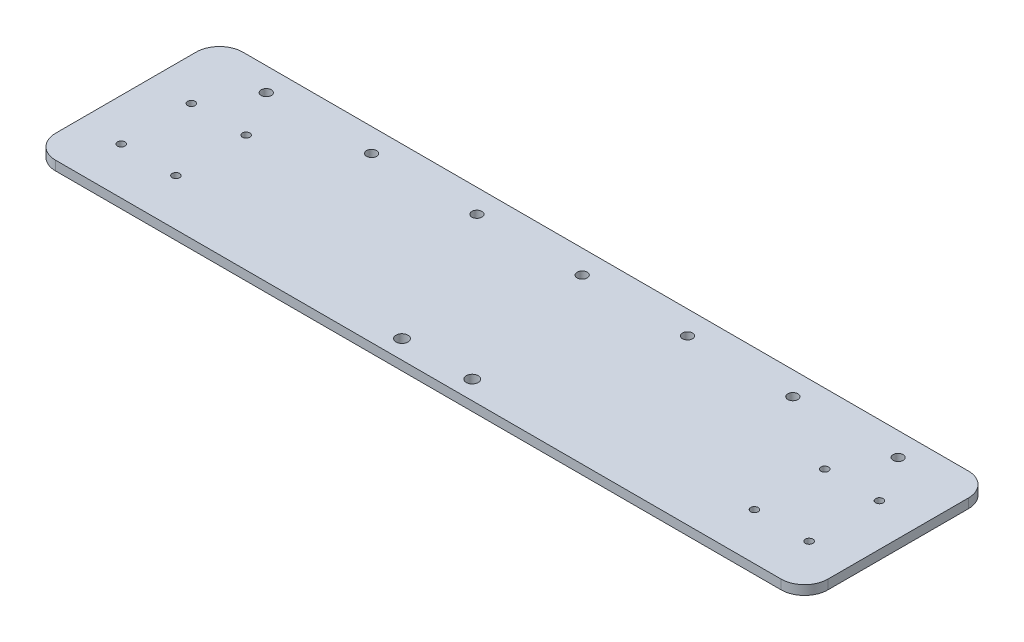
ISO-10303-21;
HEADER;
FILE_DESCRIPTION(('STEP AP214'),'2;1');
FILE_NAME('part.step','',(''),(''),'','','');
FILE_SCHEMA(('AUTOMOTIVE_DESIGN { 1 0 10303 214 1 1 1 1 }'));
ENDSEC;
DATA;
#1=APPLICATION_CONTEXT('core data for automotive mechanical design processes');
#2=APPLICATION_PROTOCOL_DEFINITION('international standard','automotive_design',2000,#1);
#3=PRODUCT_CONTEXT('',#1,'mechanical');
#4=PRODUCT('Part','Part','',(#3));
#5=PRODUCT_RELATED_PRODUCT_CATEGORY('part','',(#4));
#6=PRODUCT_DEFINITION_FORMATION('','',#4);
#7=PRODUCT_DEFINITION_CONTEXT('part definition',#1,'design');
#8=PRODUCT_DEFINITION('design','',#6,#7);
#9=PRODUCT_DEFINITION_SHAPE('','',#8);
#10=(LENGTH_UNIT() NAMED_UNIT(*) SI_UNIT(.MILLI.,.METRE.));
#11=(NAMED_UNIT(*) PLANE_ANGLE_UNIT() SI_UNIT($,.RADIAN.));
#12=(NAMED_UNIT(*) SI_UNIT($,.STERADIAN.) SOLID_ANGLE_UNIT());
#13=UNCERTAINTY_MEASURE_WITH_UNIT(LENGTH_MEASURE(1.E-05),#10,'distance_accuracy_value','');
#14=(GEOMETRIC_REPRESENTATION_CONTEXT(3) GLOBAL_UNCERTAINTY_ASSIGNED_CONTEXT((#13)) GLOBAL_UNIT_ASSIGNED_CONTEXT((#10,
#11,#12)) REPRESENTATION_CONTEXT('',''));
#15=CARTESIAN_POINT('',(0.,0.,0.));
#16=DIRECTION('',(0.,0.,1.));
#17=DIRECTION('',(1.,0.,0.));
#18=AXIS2_PLACEMENT_3D('',#15,#16,#17);
#19=CARTESIAN_POINT('',(0.,4.,0.));
#20=DIRECTION('',(0.,-1.,0.));
#21=DIRECTION('',(0.,0.,-1.));
#22=AXIS2_PLACEMENT_3D('',#19,#20,#21);
#23=PLANE('',#22);
#24=CARTESIAN_POINT('',(-135.,4.,-30.));
#25=DIRECTION('',(0.,1.,0.));
#26=DIRECTION('',(0.,0.,1.));
#27=AXIS2_PLACEMENT_3D('',#24,#25,#26);
#28=CIRCLE('',#27,2.15);
#29=CARTESIAN_POINT('',(-135.,4.,-27.85));
#30=VERTEX_POINT('',#29);
#31=EDGE_CURVE('E583',#30,#30,#28,.T.);
#32=ORIENTED_EDGE('',*,*,#31,.F.);
#33=EDGE_LOOP('',(#32));
#34=FACE_BOUND('',#33,.T.);
#35=CARTESIAN_POINT('',(-90.,4.,-30.));
#36=DIRECTION('',(0.,1.,0.));
#37=DIRECTION('',(0.,0.,1.));
#38=AXIS2_PLACEMENT_3D('',#35,#36,#37);
#39=CIRCLE('',#38,2.15);
#40=CARTESIAN_POINT('',(-90.,4.,-27.85));
#41=VERTEX_POINT('',#40);
#42=EDGE_CURVE('E582',#41,#41,#39,.T.);
#43=ORIENTED_EDGE('',*,*,#42,.F.);
#44=EDGE_LOOP('',(#43));
#45=FACE_BOUND('',#44,.T.);
#46=CARTESIAN_POINT('',(-45.,4.,-30.));
#47=DIRECTION('',(0.,1.,0.));
#48=DIRECTION('',(0.,0.,1.));
#49=AXIS2_PLACEMENT_3D('',#46,#47,#48);
#50=CIRCLE('',#49,2.15);
#51=CARTESIAN_POINT('',(-45.,4.,-27.85));
#52=VERTEX_POINT('',#51);
#53=EDGE_CURVE('E591',#52,#52,#50,.T.);
#54=ORIENTED_EDGE('',*,*,#53,.F.);
#55=EDGE_LOOP('',(#54));
#56=FACE_BOUND('',#55,.T.);
#57=CARTESIAN_POINT('',(135.,4.,-30.));
#58=DIRECTION('',(0.,1.,0.));
#59=DIRECTION('',(0.,0.,1.));
#60=AXIS2_PLACEMENT_3D('',#57,#58,#59);
#61=CIRCLE('',#60,2.15);
#62=CARTESIAN_POINT('',(135.,4.,-27.85));
#63=VERTEX_POINT('',#62);
#64=EDGE_CURVE('E599',#63,#63,#61,.T.);
#65=ORIENTED_EDGE('',*,*,#64,.F.);
#66=EDGE_LOOP('',(#65));
#67=FACE_BOUND('',#66,.T.);
#68=CARTESIAN_POINT('',(90.,4.,-30.));
#69=DIRECTION('',(0.,1.,0.));
#70=DIRECTION('',(0.,0.,1.));
#71=AXIS2_PLACEMENT_3D('',#68,#69,#70);
#72=CIRCLE('',#71,2.15);
#73=CARTESIAN_POINT('',(90.,4.,-27.85));
#74=VERTEX_POINT('',#73);
#75=EDGE_CURVE('E607',#74,#74,#72,.T.);
#76=ORIENTED_EDGE('',*,*,#75,.F.);
#77=EDGE_LOOP('',(#76));
#78=FACE_BOUND('',#77,.T.);
#79=CARTESIAN_POINT('',(45.,4.,-30.));
#80=DIRECTION('',(0.,1.,0.));
#81=DIRECTION('',(0.,0.,1.));
#82=AXIS2_PLACEMENT_3D('',#79,#80,#81);
#83=CIRCLE('',#82,2.15);
#84=CARTESIAN_POINT('',(45.,4.,-27.85));
#85=VERTEX_POINT('',#84);
#86=EDGE_CURVE('E574',#85,#85,#83,.T.);
#87=ORIENTED_EDGE('',*,*,#86,.F.);
#88=EDGE_LOOP('',(#87));
#89=FACE_BOUND('',#88,.T.);
#90=CARTESIAN_POINT('',(0.,4.,-30.));
#91=DIRECTION('',(0.,1.,0.));
#92=DIRECTION('',(0.,0.,1.));
#93=AXIS2_PLACEMENT_3D('',#90,#91,#92);
#94=CIRCLE('',#93,2.15);
#95=CARTESIAN_POINT('',(0.,4.,-27.85));
#96=VERTEX_POINT('',#95);
#97=EDGE_CURVE('E544',#96,#96,#94,.T.);
#98=ORIENTED_EDGE('',*,*,#97,.F.);
#99=EDGE_LOOP('',(#98));
#100=FACE_BOUND('',#99,.T.);
#101=CARTESIAN_POINT('',(123.6,4.,-10.));
#102=DIRECTION('',(0.,-1.,0.));
#103=DIRECTION('',(0.,0.,1.));
#104=AXIS2_PLACEMENT_3D('',#101,#102,#103);
#105=CIRCLE('',#104,1.60000000000002);
#106=CARTESIAN_POINT('',(123.6,4.,-8.40000000000002));
#107=VERTEX_POINT('',#106);
#108=EDGE_CURVE('E543',#107,#107,#105,.T.);
#109=ORIENTED_EDGE('',*,*,#108,.T.);
#110=EDGE_LOOP('',(#109));
#111=FACE_BOUND('',#110,.T.);
#112=CARTESIAN_POINT('',(123.6,4.,20.));
#113=DIRECTION('',(0.,-1.,0.));
#114=DIRECTION('',(0.,0.,1.));
#115=AXIS2_PLACEMENT_3D('',#112,#113,#114);
#116=CIRCLE('',#115,1.60000000000002);
#117=CARTESIAN_POINT('',(123.6,4.,21.6));
#118=VERTEX_POINT('',#117);
#119=EDGE_CURVE('E552',#118,#118,#116,.T.);
#120=ORIENTED_EDGE('',*,*,#119,.T.);
#121=EDGE_LOOP('',(#120));
#122=FACE_BOUND('',#121,.T.);
#123=CARTESIAN_POINT('',(147.,4.,20.));
#124=DIRECTION('',(0.,-1.,0.));
#125=DIRECTION('',(0.,0.,1.));
#126=AXIS2_PLACEMENT_3D('',#123,#124,#125);
#127=CIRCLE('',#126,1.59999999999999);
#128=CARTESIAN_POINT('',(147.,4.,21.5999999999999));
#129=VERTEX_POINT('',#128);
#130=EDGE_CURVE('E537',#129,#129,#127,.T.);
#131=ORIENTED_EDGE('',*,*,#130,.T.);
#132=EDGE_LOOP('',(#131));
#133=FACE_BOUND('',#132,.T.);
#134=CARTESIAN_POINT('',(147.,4.,-10.));
#135=DIRECTION('',(0.,-1.,0.));
#136=DIRECTION('',(0.,0.,1.));
#137=AXIS2_PLACEMENT_3D('',#134,#135,#136);
#138=CIRCLE('',#137,1.59999999999999);
#139=CARTESIAN_POINT('',(147.,4.,-8.40000000000005));
#140=VERTEX_POINT('',#139);
#141=EDGE_CURVE('E528',#140,#140,#138,.T.);
#142=ORIENTED_EDGE('',*,*,#141,.T.);
#143=EDGE_LOOP('',(#142));
#144=FACE_BOUND('',#143,.T.);
#145=CARTESIAN_POINT('',(-123.6,4.,-10.));
#146=DIRECTION('',(0.,1.,0.));
#147=DIRECTION('',(0.,0.,1.));
#148=AXIS2_PLACEMENT_3D('',#145,#146,#147);
#149=CIRCLE('',#148,1.60000000000002);
#150=CARTESIAN_POINT('',(-123.6,4.,-8.40000000000002));
#151=VERTEX_POINT('',#150);
#152=EDGE_CURVE('E521',#151,#151,#149,.T.);
#153=ORIENTED_EDGE('',*,*,#152,.F.);
#154=EDGE_LOOP('',(#153));
#155=FACE_BOUND('',#154,.T.);
#156=CARTESIAN_POINT('',(-123.6,4.,20.));
#157=DIRECTION('',(0.,1.,0.));
#158=DIRECTION('',(0.,0.,1.));
#159=AXIS2_PLACEMENT_3D('',#156,#157,#158);
#160=CIRCLE('',#159,1.60000000000002);
#161=CARTESIAN_POINT('',(-123.6,4.,21.6));
#162=VERTEX_POINT('',#161);
#163=EDGE_CURVE('E508',#162,#162,#160,.T.);
#164=ORIENTED_EDGE('',*,*,#163,.F.);
#165=EDGE_LOOP('',(#164));
#166=FACE_BOUND('',#165,.T.);
#167=CARTESIAN_POINT('',(-147.,4.,20.));
#168=DIRECTION('',(0.,1.,0.));
#169=DIRECTION('',(0.,0.,1.));
#170=AXIS2_PLACEMENT_3D('',#167,#168,#169);
#171=CIRCLE('',#170,1.59999999999999);
#172=CARTESIAN_POINT('',(-147.,4.,21.5999999999999));
#173=VERTEX_POINT('',#172);
#174=EDGE_CURVE('E499',#173,#173,#171,.T.);
#175=ORIENTED_EDGE('',*,*,#174,.F.);
#176=EDGE_LOOP('',(#175));
#177=FACE_BOUND('',#176,.T.);
#178=CARTESIAN_POINT('',(-147.,4.,-10.));
#179=DIRECTION('',(0.,1.,0.));
#180=DIRECTION('',(0.,0.,1.));
#181=AXIS2_PLACEMENT_3D('',#178,#179,#180);
#182=CIRCLE('',#181,1.59999999999999);
#183=CARTESIAN_POINT('',(-147.,4.,-8.40000000000005));
#184=VERTEX_POINT('',#183);
#185=EDGE_CURVE('E225',#184,#184,#182,.T.);
#186=ORIENTED_EDGE('',*,*,#185,.F.);
#187=EDGE_LOOP('',(#186));
#188=FACE_BOUND('',#187,.T.);
#189=DIRECTION('',(1.,0.,0.));
#190=VECTOR('',#189,1.);
#191=CARTESIAN_POINT('',(-165.,4.,40.));
#192=LINE('',#191,#190);
#193=CARTESIAN_POINT('',(-155.,4.,40.));
#194=VERTEX_POINT('',#193);
#195=CARTESIAN_POINT('',(155.,4.,40.));
#196=VERTEX_POINT('',#195);
#197=EDGE_CURVE('E149',#194,#196,#192,.T.);
#198=ORIENTED_EDGE('',*,*,#197,.T.);
#199=CARTESIAN_POINT('',(155.,4.,30.));
#200=DIRECTION('',(0.,-1.,0.));
#201=DIRECTION('',(0.,0.,-1.));
#202=AXIS2_PLACEMENT_3D('',#199,#200,#201);
#203=CIRCLE('',#202,10.);
#204=CARTESIAN_POINT('',(165.,4.,30.));
#205=VERTEX_POINT('',#204);
#206=EDGE_CURVE('E173',#196,#205,#203,.F.);
#207=ORIENTED_EDGE('',*,*,#206,.T.);
#208=DIRECTION('',(0.,0.,-1.));
#209=VECTOR('',#208,1.);
#210=CARTESIAN_POINT('',(165.,4.,-40.));
#211=LINE('',#210,#209);
#212=CARTESIAN_POINT('',(165.,4.,-30.));
#213=VERTEX_POINT('',#212);
#214=EDGE_CURVE('E126',#205,#213,#211,.T.);
#215=ORIENTED_EDGE('',*,*,#214,.T.);
#216=CARTESIAN_POINT('',(155.,4.,-30.));
#217=DIRECTION('',(0.,-1.,0.));
#218=DIRECTION('',(0.,0.,-1.));
#219=AXIS2_PLACEMENT_3D('',#216,#217,#218);
#220=CIRCLE('',#219,10.);
#221=CARTESIAN_POINT('',(155.,4.,-40.));
#222=VERTEX_POINT('',#221);
#223=EDGE_CURVE('E170',#213,#222,#220,.F.);
#224=ORIENTED_EDGE('',*,*,#223,.T.);
#225=DIRECTION('',(-1.,0.,0.));
#226=VECTOR('',#225,1.);
#227=CARTESIAN_POINT('',(165.,4.,-40.));
#228=LINE('',#227,#226);
#229=CARTESIAN_POINT('',(-155.,4.,-40.));
#230=VERTEX_POINT('',#229);
#231=EDGE_CURVE('E199',#222,#230,#228,.T.);
#232=ORIENTED_EDGE('',*,*,#231,.T.);
#233=CARTESIAN_POINT('',(-155.,4.,-30.));
#234=DIRECTION('',(0.,-1.,0.));
#235=DIRECTION('',(0.,0.,-1.));
#236=AXIS2_PLACEMENT_3D('',#233,#234,#235);
#237=CIRCLE('',#236,10.);
#238=CARTESIAN_POINT('',(-165.,4.,-30.));
#239=VERTEX_POINT('',#238);
#240=EDGE_CURVE('E60',#230,#239,#237,.F.);
#241=ORIENTED_EDGE('',*,*,#240,.T.);
#242=DIRECTION('',(0.,0.,1.));
#243=VECTOR('',#242,1.);
#244=CARTESIAN_POINT('',(-165.,4.,-40.));
#245=LINE('',#244,#243);
#246=CARTESIAN_POINT('',(-165.,4.,30.));
#247=VERTEX_POINT('',#246);
#248=EDGE_CURVE('E151',#239,#247,#245,.T.);
#249=ORIENTED_EDGE('',*,*,#248,.T.);
#250=CARTESIAN_POINT('',(-155.,4.,30.));
#251=DIRECTION('',(0.,-1.,0.));
#252=DIRECTION('',(0.,0.,-1.));
#253=AXIS2_PLACEMENT_3D('',#250,#251,#252);
#254=CIRCLE('',#253,10.);
#255=EDGE_CURVE('E167',#247,#194,#254,.F.);
#256=ORIENTED_EDGE('',*,*,#255,.T.);
#257=EDGE_LOOP('',(#198,#207,#215,#224,#232,#241,#249,#256));
#258=FACE_BOUND('',#257,.T.);
#259=CARTESIAN_POINT('',(-15.,4.,32.));
#260=DIRECTION('',(0.,1.,0.));
#261=DIRECTION('',(0.,0.,1.));
#262=AXIS2_PLACEMENT_3D('',#259,#260,#261);
#263=CIRCLE('',#262,2.55);
#264=CARTESIAN_POINT('',(-15.,4.,34.55));
#265=VERTEX_POINT('',#264);
#266=EDGE_CURVE('E143',#265,#265,#263,.T.);
#267=ORIENTED_EDGE('',*,*,#266,.F.);
#268=EDGE_LOOP('',(#267));
#269=FACE_BOUND('',#268,.T.);
#270=CARTESIAN_POINT('',(15.,4.,32.));
#271=DIRECTION('',(0.,1.,0.));
#272=DIRECTION('',(0.,0.,1.));
#273=AXIS2_PLACEMENT_3D('',#270,#271,#272);
#274=CIRCLE('',#273,2.54999999999999);
#275=CARTESIAN_POINT('',(15.,4.,34.55));
#276=VERTEX_POINT('',#275);
#277=EDGE_CURVE('E216',#276,#276,#274,.T.);
#278=ORIENTED_EDGE('',*,*,#277,.F.);
#279=EDGE_LOOP('',(#278));
#280=FACE_BOUND('',#279,.T.);
#281=ADVANCED_FACE('F39',(#34,#45,#56,#67,#78,#89,#100,#111,#122,#133,#144,#155,#166,#177,#188,
#258,#269,#280),#23,.F.);
#282=CARTESIAN_POINT('',(0.,0.,0.));
#283=DIRECTION('',(0.,-1.,0.));
#284=DIRECTION('',(0.,0.,-1.));
#285=AXIS2_PLACEMENT_3D('',#282,#283,#284);
#286=PLANE('',#285);
#287=CARTESIAN_POINT('',(-135.,0.,-30.));
#288=DIRECTION('',(0.,1.,0.));
#289=DIRECTION('',(0.,0.,1.));
#290=AXIS2_PLACEMENT_3D('',#287,#288,#289);
#291=CIRCLE('',#290,2.15);
#292=CARTESIAN_POINT('',(-135.,0.,-27.85));
#293=VERTEX_POINT('',#292);
#294=EDGE_CURVE('E579',#293,#293,#291,.T.);
#295=ORIENTED_EDGE('',*,*,#294,.T.);
#296=EDGE_LOOP('',(#295));
#297=FACE_BOUND('',#296,.T.);
#298=CARTESIAN_POINT('',(-90.,0.,-30.));
#299=DIRECTION('',(0.,1.,0.));
#300=DIRECTION('',(0.,0.,1.));
#301=AXIS2_PLACEMENT_3D('',#298,#299,#300);
#302=CIRCLE('',#301,2.15);
#303=CARTESIAN_POINT('',(-90.,0.,-27.85));
#304=VERTEX_POINT('',#303);
#305=EDGE_CURVE('E587',#304,#304,#302,.T.);
#306=ORIENTED_EDGE('',*,*,#305,.T.);
#307=EDGE_LOOP('',(#306));
#308=FACE_BOUND('',#307,.T.);
#309=CARTESIAN_POINT('',(-45.,0.,-30.));
#310=DIRECTION('',(0.,1.,0.));
#311=DIRECTION('',(0.,0.,1.));
#312=AXIS2_PLACEMENT_3D('',#309,#310,#311);
#313=CIRCLE('',#312,2.15);
#314=CARTESIAN_POINT('',(-45.,0.,-27.85));
#315=VERTEX_POINT('',#314);
#316=EDGE_CURVE('E595',#315,#315,#313,.T.);
#317=ORIENTED_EDGE('',*,*,#316,.T.);
#318=EDGE_LOOP('',(#317));
#319=FACE_BOUND('',#318,.T.);
#320=CARTESIAN_POINT('',(135.,0.,-30.));
#321=DIRECTION('',(0.,1.,0.));
#322=DIRECTION('',(0.,0.,1.));
#323=AXIS2_PLACEMENT_3D('',#320,#321,#322);
#324=CIRCLE('',#323,2.15);
#325=CARTESIAN_POINT('',(135.,0.,-27.85));
#326=VERTEX_POINT('',#325);
#327=EDGE_CURVE('E603',#326,#326,#324,.T.);
#328=ORIENTED_EDGE('',*,*,#327,.T.);
#329=EDGE_LOOP('',(#328));
#330=FACE_BOUND('',#329,.T.);
#331=CARTESIAN_POINT('',(90.,0.,-30.));
#332=DIRECTION('',(0.,1.,0.));
#333=DIRECTION('',(0.,0.,1.));
#334=AXIS2_PLACEMENT_3D('',#331,#332,#333);
#335=CIRCLE('',#334,2.15);
#336=CARTESIAN_POINT('',(90.,0.,-27.85));
#337=VERTEX_POINT('',#336);
#338=EDGE_CURVE('E578',#337,#337,#335,.T.);
#339=ORIENTED_EDGE('',*,*,#338,.T.);
#340=EDGE_LOOP('',(#339));
#341=FACE_BOUND('',#340,.T.);
#342=CARTESIAN_POINT('',(45.,0.,-30.));
#343=DIRECTION('',(0.,1.,0.));
#344=DIRECTION('',(0.,0.,1.));
#345=AXIS2_PLACEMENT_3D('',#342,#343,#344);
#346=CIRCLE('',#345,2.15);
#347=CARTESIAN_POINT('',(45.,0.,-27.85));
#348=VERTEX_POINT('',#347);
#349=EDGE_CURVE('E567',#348,#348,#346,.T.);
#350=ORIENTED_EDGE('',*,*,#349,.T.);
#351=EDGE_LOOP('',(#350));
#352=FACE_BOUND('',#351,.T.);
#353=CARTESIAN_POINT('',(0.,0.,-30.));
#354=DIRECTION('',(0.,1.,0.));
#355=DIRECTION('',(0.,0.,1.));
#356=AXIS2_PLACEMENT_3D('',#353,#354,#355);
#357=CIRCLE('',#356,2.15);
#358=CARTESIAN_POINT('',(0.,0.,-27.85));
#359=VERTEX_POINT('',#358);
#360=EDGE_CURVE('E563',#359,#359,#357,.T.);
#361=ORIENTED_EDGE('',*,*,#360,.T.);
#362=EDGE_LOOP('',(#361));
#363=FACE_BOUND('',#362,.T.);
#364=CARTESIAN_POINT('',(123.6,0.,-10.));
#365=DIRECTION('',(0.,-1.,0.));
#366=DIRECTION('',(0.,0.,1.));
#367=AXIS2_PLACEMENT_3D('',#364,#365,#366);
#368=CIRCLE('',#367,1.60000000000002);
#369=CARTESIAN_POINT('',(123.6,0.,-8.40000000000002));
#370=VERTEX_POINT('',#369);
#371=EDGE_CURVE('E539',#370,#370,#368,.T.);
#372=ORIENTED_EDGE('',*,*,#371,.F.);
#373=EDGE_LOOP('',(#372));
#374=FACE_BOUND('',#373,.T.);
#375=CARTESIAN_POINT('',(123.6,0.,20.));
#376=DIRECTION('',(0.,-1.,0.));
#377=DIRECTION('',(0.,0.,1.));
#378=AXIS2_PLACEMENT_3D('',#375,#376,#377);
#379=CIRCLE('',#378,1.60000000000002);
#380=CARTESIAN_POINT('',(123.6,0.,21.6));
#381=VERTEX_POINT('',#380);
#382=EDGE_CURVE('E548',#381,#381,#379,.T.);
#383=ORIENTED_EDGE('',*,*,#382,.F.);
#384=EDGE_LOOP('',(#383));
#385=FACE_BOUND('',#384,.T.);
#386=CARTESIAN_POINT('',(147.,0.,20.));
#387=DIRECTION('',(0.,-1.,0.));
#388=DIRECTION('',(0.,0.,1.));
#389=AXIS2_PLACEMENT_3D('',#386,#387,#388);
#390=CIRCLE('',#389,1.59999999999999);
#391=CARTESIAN_POINT('',(147.,0.,21.5999999999999));
#392=VERTEX_POINT('',#391);
#393=EDGE_CURVE('E556',#392,#392,#390,.T.);
#394=ORIENTED_EDGE('',*,*,#393,.F.);
#395=EDGE_LOOP('',(#394));
#396=FACE_BOUND('',#395,.T.);
#397=CARTESIAN_POINT('',(147.,0.,-10.));
#398=DIRECTION('',(0.,-1.,0.));
#399=DIRECTION('',(0.,0.,1.));
#400=AXIS2_PLACEMENT_3D('',#397,#398,#399);
#401=CIRCLE('',#400,1.59999999999999);
#402=CARTESIAN_POINT('',(147.,0.,-8.40000000000005));
#403=VERTEX_POINT('',#402);
#404=EDGE_CURVE('E511',#403,#403,#401,.T.);
#405=ORIENTED_EDGE('',*,*,#404,.F.);
#406=EDGE_LOOP('',(#405));
#407=FACE_BOUND('',#406,.T.);
#408=CARTESIAN_POINT('',(-123.6,0.,-10.));
#409=DIRECTION('',(0.,1.,0.));
#410=DIRECTION('',(0.,0.,1.));
#411=AXIS2_PLACEMENT_3D('',#408,#409,#410);
#412=CIRCLE('',#411,1.60000000000002);
#413=CARTESIAN_POINT('',(-123.6,0.,-8.40000000000002));
#414=VERTEX_POINT('',#413);
#415=EDGE_CURVE('E525',#414,#414,#412,.T.);
#416=ORIENTED_EDGE('',*,*,#415,.T.);
#417=EDGE_LOOP('',(#416));
#418=FACE_BOUND('',#417,.T.);
#419=CARTESIAN_POINT('',(-123.6,0.,20.));
#420=DIRECTION('',(0.,1.,0.));
#421=DIRECTION('',(0.,0.,1.));
#422=AXIS2_PLACEMENT_3D('',#419,#420,#421);
#423=CIRCLE('',#422,1.60000000000002);
#424=CARTESIAN_POINT('',(-123.6,0.,21.6));
#425=VERTEX_POINT('',#424);
#426=EDGE_CURVE('E517',#425,#425,#423,.T.);
#427=ORIENTED_EDGE('',*,*,#426,.T.);
#428=EDGE_LOOP('',(#427));
#429=FACE_BOUND('',#428,.T.);
#430=CARTESIAN_POINT('',(-147.,0.,20.));
#431=DIRECTION('',(0.,1.,0.));
#432=DIRECTION('',(0.,0.,1.));
#433=AXIS2_PLACEMENT_3D('',#430,#431,#432);
#434=CIRCLE('',#433,1.59999999999999);
#435=CARTESIAN_POINT('',(-147.,0.,21.5999999999999));
#436=VERTEX_POINT('',#435);
#437=EDGE_CURVE('E503',#436,#436,#434,.T.);
#438=ORIENTED_EDGE('',*,*,#437,.T.);
#439=EDGE_LOOP('',(#438));
#440=FACE_BOUND('',#439,.T.);
#441=CARTESIAN_POINT('',(-147.,0.,-10.));
#442=DIRECTION('',(0.,1.,0.));
#443=DIRECTION('',(0.,0.,1.));
#444=AXIS2_PLACEMENT_3D('',#441,#442,#443);
#445=CIRCLE('',#444,1.59999999999999);
#446=CARTESIAN_POINT('',(-147.,0.,-8.40000000000005));
#447=VERTEX_POINT('',#446);
#448=EDGE_CURVE('E228',#447,#447,#445,.T.);
#449=ORIENTED_EDGE('',*,*,#448,.T.);
#450=EDGE_LOOP('',(#449));
#451=FACE_BOUND('',#450,.T.);
#452=CARTESIAN_POINT('',(-15.,0.,32.));
#453=DIRECTION('',(0.,1.,0.));
#454=DIRECTION('',(0.,0.,1.));
#455=AXIS2_PLACEMENT_3D('',#452,#453,#454);
#456=CIRCLE('',#455,2.55);
#457=CARTESIAN_POINT('',(-15.,0.,34.55));
#458=VERTEX_POINT('',#457);
#459=EDGE_CURVE('E202',#458,#458,#456,.T.);
#460=ORIENTED_EDGE('',*,*,#459,.T.);
#461=EDGE_LOOP('',(#460));
#462=FACE_BOUND('',#461,.T.);
#463=DIRECTION('',(0.,0.,-1.));
#464=VECTOR('',#463,1.);
#465=CARTESIAN_POINT('',(165.,0.,-40.));
#466=LINE('',#465,#464);
#467=CARTESIAN_POINT('',(165.,0.,30.));
#468=VERTEX_POINT('',#467);
#469=CARTESIAN_POINT('',(165.,0.,-30.));
#470=VERTEX_POINT('',#469);
#471=EDGE_CURVE('E123',#468,#470,#466,.T.);
#472=ORIENTED_EDGE('',*,*,#471,.F.);
#473=CARTESIAN_POINT('',(155.,0.,30.));
#474=DIRECTION('',(0.,-1.,0.));
#475=DIRECTION('',(0.,0.,-1.));
#476=AXIS2_PLACEMENT_3D('',#473,#474,#475);
#477=CIRCLE('',#476,10.);
#478=CARTESIAN_POINT('',(155.,0.,40.));
#479=VERTEX_POINT('',#478);
#480=EDGE_CURVE('E105',#468,#479,#477,.T.);
#481=ORIENTED_EDGE('',*,*,#480,.T.);
#482=DIRECTION('',(1.,0.,0.));
#483=VECTOR('',#482,1.);
#484=CARTESIAN_POINT('',(-165.,0.,40.));
#485=LINE('',#484,#483);
#486=CARTESIAN_POINT('',(-155.,0.,40.));
#487=VERTEX_POINT('',#486);
#488=EDGE_CURVE('E136',#487,#479,#485,.T.);
#489=ORIENTED_EDGE('',*,*,#488,.F.);
#490=CARTESIAN_POINT('',(-155.,0.,30.));
#491=DIRECTION('',(0.,-1.,0.));
#492=DIRECTION('',(0.,0.,-1.));
#493=AXIS2_PLACEMENT_3D('',#490,#491,#492);
#494=CIRCLE('',#493,10.);
#495=CARTESIAN_POINT('',(-165.,0.,30.));
#496=VERTEX_POINT('',#495);
#497=EDGE_CURVE('E155',#487,#496,#494,.T.);
#498=ORIENTED_EDGE('',*,*,#497,.T.);
#499=DIRECTION('',(0.,0.,1.));
#500=VECTOR('',#499,1.);
#501=CARTESIAN_POINT('',(-165.,0.,-40.));
#502=LINE('',#501,#500);
#503=CARTESIAN_POINT('',(-165.,0.,-30.));
#504=VERTEX_POINT('',#503);
#505=EDGE_CURVE('E141',#504,#496,#502,.T.);
#506=ORIENTED_EDGE('',*,*,#505,.F.);
#507=CARTESIAN_POINT('',(-155.,0.,-30.));
#508=DIRECTION('',(0.,-1.,0.));
#509=DIRECTION('',(0.,0.,-1.));
#510=AXIS2_PLACEMENT_3D('',#507,#508,#509);
#511=CIRCLE('',#510,10.);
#512=CARTESIAN_POINT('',(-155.,0.,-40.));
#513=VERTEX_POINT('',#512);
#514=EDGE_CURVE('E128',#504,#513,#511,.T.);
#515=ORIENTED_EDGE('',*,*,#514,.T.);
#516=DIRECTION('',(-1.,0.,0.));
#517=VECTOR('',#516,1.);
#518=CARTESIAN_POINT('',(165.,0.,-40.));
#519=LINE('',#518,#517);
#520=CARTESIAN_POINT('',(155.,0.,-40.));
#521=VERTEX_POINT('',#520);
#522=EDGE_CURVE('E135',#521,#513,#519,.T.);
#523=ORIENTED_EDGE('',*,*,#522,.F.);
#524=CARTESIAN_POINT('',(155.,0.,-30.));
#525=DIRECTION('',(0.,-1.,0.));
#526=DIRECTION('',(0.,0.,-1.));
#527=AXIS2_PLACEMENT_3D('',#524,#525,#526);
#528=CIRCLE('',#527,10.);
#529=EDGE_CURVE('E117',#521,#470,#528,.T.);
#530=ORIENTED_EDGE('',*,*,#529,.T.);
#531=EDGE_LOOP('',(#472,#481,#489,#498,#506,#515,#523,#530));
#532=FACE_BOUND('',#531,.T.);
#533=CARTESIAN_POINT('',(15.,0.,32.));
#534=DIRECTION('',(0.,1.,0.));
#535=DIRECTION('',(0.,0.,1.));
#536=AXIS2_PLACEMENT_3D('',#533,#534,#535);
#537=CIRCLE('',#536,2.54999999999999);
#538=CARTESIAN_POINT('',(15.,0.,34.55));
#539=VERTEX_POINT('',#538);
#540=EDGE_CURVE('E219',#539,#539,#537,.T.);
#541=ORIENTED_EDGE('',*,*,#540,.T.);
#542=EDGE_LOOP('',(#541));
#543=FACE_BOUND('',#542,.T.);
#544=ADVANCED_FACE('F131',(#297,#308,#319,#330,#341,#352,#363,#374,#385,#396,#407,#418,#429,
#440,#451,#462,#532,#543),#286,.T.);
#545=CARTESIAN_POINT('',(-165.,4.,40.));
#546=DIRECTION('',(0.,0.,-1.));
#547=DIRECTION('',(-1.,0.,0.));
#548=AXIS2_PLACEMENT_3D('',#545,#546,#547);
#549=PLANE('',#548);
#550=ORIENTED_EDGE('',*,*,#488,.T.);
#551=DIRECTION('',(0.,-1.,0.));
#552=VECTOR('',#551,1.);
#553=CARTESIAN_POINT('',(155.,4.,40.));
#554=LINE('',#553,#552);
#555=EDGE_CURVE('E110',#479,#196,#554,.F.);
#556=ORIENTED_EDGE('',*,*,#555,.T.);
#557=ORIENTED_EDGE('',*,*,#197,.F.);
#558=DIRECTION('',(0.,-1.,0.));
#559=VECTOR('',#558,1.);
#560=CARTESIAN_POINT('',(-155.,4.,40.));
#561=LINE('',#560,#559);
#562=EDGE_CURVE('E116',#194,#487,#561,.T.);
#563=ORIENTED_EDGE('',*,*,#562,.T.);
#564=EDGE_LOOP('',(#550,#556,#557,#563));
#565=FACE_BOUND('',#564,.T.);
#566=ADVANCED_FACE('F194',(#565),#549,.F.);
#567=CARTESIAN_POINT('',(165.,4.,-40.));
#568=DIRECTION('',(-1.,0.,0.));
#569=DIRECTION('',(0.,0.,1.));
#570=AXIS2_PLACEMENT_3D('',#567,#568,#569);
#571=PLANE('',#570);
#572=ORIENTED_EDGE('',*,*,#214,.F.);
#573=DIRECTION('',(0.,-1.,0.));
#574=VECTOR('',#573,1.);
#575=CARTESIAN_POINT('',(165.,4.,30.));
#576=LINE('',#575,#574);
#577=EDGE_CURVE('E109',#205,#468,#576,.T.);
#578=ORIENTED_EDGE('',*,*,#577,.T.);
#579=ORIENTED_EDGE('',*,*,#471,.T.);
#580=DIRECTION('',(0.,-1.,0.));
#581=VECTOR('',#580,1.);
#582=CARTESIAN_POINT('',(165.,4.,-30.));
#583=LINE('',#582,#581);
#584=EDGE_CURVE('E129',#470,#213,#583,.F.);
#585=ORIENTED_EDGE('',*,*,#584,.T.);
#586=EDGE_LOOP('',(#572,#578,#579,#585));
#587=FACE_BOUND('',#586,.T.);
#588=ADVANCED_FACE('F122',(#587),#571,.F.);
#589=CARTESIAN_POINT('',(165.,4.,-40.));
#590=DIRECTION('',(0.,0.,1.));
#591=DIRECTION('',(1.,0.,0.));
#592=AXIS2_PLACEMENT_3D('',#589,#590,#591);
#593=PLANE('',#592);
#594=ORIENTED_EDGE('',*,*,#231,.F.);
#595=DIRECTION('',(0.,-1.,0.));
#596=VECTOR('',#595,1.);
#597=CARTESIAN_POINT('',(155.,4.,-40.));
#598=LINE('',#597,#596);
#599=EDGE_CURVE('E179',#222,#521,#598,.T.);
#600=ORIENTED_EDGE('',*,*,#599,.T.);
#601=ORIENTED_EDGE('',*,*,#522,.T.);
#602=DIRECTION('',(0.,-1.,0.));
#603=VECTOR('',#602,1.);
#604=CARTESIAN_POINT('',(-155.,4.,-40.));
#605=LINE('',#604,#603);
#606=EDGE_CURVE('E176',#513,#230,#605,.F.);
#607=ORIENTED_EDGE('',*,*,#606,.T.);
#608=EDGE_LOOP('',(#594,#600,#601,#607));
#609=FACE_BOUND('',#608,.T.);
#610=ADVANCED_FACE('F251',(#609),#593,.F.);
#611=CARTESIAN_POINT('',(-165.,4.,-40.));
#612=DIRECTION('',(1.,0.,0.));
#613=DIRECTION('',(0.,0.,-1.));
#614=AXIS2_PLACEMENT_3D('',#611,#612,#613);
#615=PLANE('',#614);
#616=ORIENTED_EDGE('',*,*,#505,.T.);
#617=DIRECTION('',(0.,-1.,0.));
#618=VECTOR('',#617,1.);
#619=CARTESIAN_POINT('',(-165.,4.,30.));
#620=LINE('',#619,#618);
#621=EDGE_CURVE('E11',#496,#247,#620,.F.);
#622=ORIENTED_EDGE('',*,*,#621,.T.);
#623=ORIENTED_EDGE('',*,*,#248,.F.);
#624=DIRECTION('',(0.,-1.,0.));
#625=VECTOR('',#624,1.);
#626=CARTESIAN_POINT('',(-165.,4.,-30.));
#627=LINE('',#626,#625);
#628=EDGE_CURVE('E48',#239,#504,#627,.T.);
#629=ORIENTED_EDGE('',*,*,#628,.T.);
#630=EDGE_LOOP('',(#616,#622,#623,#629));
#631=FACE_BOUND('',#630,.T.);
#632=ADVANCED_FACE('F186',(#631),#615,.F.);
#633=CARTESIAN_POINT('',(-15.,4.,32.));
#634=DIRECTION('',(0.,-1.,0.));
#635=DIRECTION('',(0.,0.,-1.));
#636=AXIS2_PLACEMENT_3D('',#633,#634,#635);
#637=CYLINDRICAL_SURFACE('',#636,2.55);
#638=ORIENTED_EDGE('',*,*,#266,.T.);
#639=EDGE_LOOP('',(#638));
#640=FACE_BOUND('',#639,.T.);
#641=ORIENTED_EDGE('',*,*,#459,.F.);
#642=EDGE_LOOP('',(#641));
#643=FACE_BOUND('',#642,.T.);
#644=ADVANCED_FACE('F232',(#640,#643),#637,.F.);
#645=CARTESIAN_POINT('',(15.,4.,32.));
#646=DIRECTION('',(0.,-1.,0.));
#647=DIRECTION('',(0.,0.,-1.));
#648=AXIS2_PLACEMENT_3D('',#645,#646,#647);
#649=CYLINDRICAL_SURFACE('',#648,2.54999999999999);
#650=ORIENTED_EDGE('',*,*,#277,.T.);
#651=EDGE_LOOP('',(#650));
#652=FACE_BOUND('',#651,.T.);
#653=ORIENTED_EDGE('',*,*,#540,.F.);
#654=EDGE_LOOP('',(#653));
#655=FACE_BOUND('',#654,.T.);
#656=ADVANCED_FACE('F235',(#652,#655),#649,.F.);
#657=CARTESIAN_POINT('',(-147.,4.,-10.));
#658=DIRECTION('',(0.,-1.,0.));
#659=DIRECTION('',(0.,0.,-1.));
#660=AXIS2_PLACEMENT_3D('',#657,#658,#659);
#661=CYLINDRICAL_SURFACE('',#660,1.59999999999999);
#662=ORIENTED_EDGE('',*,*,#185,.T.);
#663=EDGE_LOOP('',(#662));
#664=FACE_BOUND('',#663,.T.);
#665=ORIENTED_EDGE('',*,*,#448,.F.);
#666=EDGE_LOOP('',(#665));
#667=FACE_BOUND('',#666,.T.);
#668=ADVANCED_FACE('F463',(#664,#667),#661,.F.);
#669=CARTESIAN_POINT('',(-147.,4.,20.));
#670=DIRECTION('',(0.,-1.,0.));
#671=DIRECTION('',(0.,0.,-1.));
#672=AXIS2_PLACEMENT_3D('',#669,#670,#671);
#673=CYLINDRICAL_SURFACE('',#672,1.59999999999999);
#674=ORIENTED_EDGE('',*,*,#174,.T.);
#675=EDGE_LOOP('',(#674));
#676=FACE_BOUND('',#675,.T.);
#677=ORIENTED_EDGE('',*,*,#437,.F.);
#678=EDGE_LOOP('',(#677));
#679=FACE_BOUND('',#678,.T.);
#680=ADVANCED_FACE('F453',(#676,#679),#673,.F.);
#681=CARTESIAN_POINT('',(-123.6,4.,20.));
#682=DIRECTION('',(0.,-1.,0.));
#683=DIRECTION('',(0.,0.,-1.));
#684=AXIS2_PLACEMENT_3D('',#681,#682,#683);
#685=CYLINDRICAL_SURFACE('',#684,1.60000000000002);
#686=ORIENTED_EDGE('',*,*,#163,.T.);
#687=EDGE_LOOP('',(#686));
#688=FACE_BOUND('',#687,.T.);
#689=ORIENTED_EDGE('',*,*,#426,.F.);
#690=EDGE_LOOP('',(#689));
#691=FACE_BOUND('',#690,.T.);
#692=ADVANCED_FACE('F443',(#688,#691),#685,.F.);
#693=CARTESIAN_POINT('',(-123.6,4.,-10.));
#694=DIRECTION('',(0.,-1.,0.));
#695=DIRECTION('',(0.,0.,-1.));
#696=AXIS2_PLACEMENT_3D('',#693,#694,#695);
#697=CYLINDRICAL_SURFACE('',#696,1.60000000000002);
#698=ORIENTED_EDGE('',*,*,#152,.T.);
#699=EDGE_LOOP('',(#698));
#700=FACE_BOUND('',#699,.T.);
#701=ORIENTED_EDGE('',*,*,#415,.F.);
#702=EDGE_LOOP('',(#701));
#703=FACE_BOUND('',#702,.T.);
#704=ADVANCED_FACE('F433',(#700,#703),#697,.F.);
#705=CARTESIAN_POINT('',(147.,4.,-10.));
#706=DIRECTION('',(0.,-1.,0.));
#707=DIRECTION('',(0.,0.,-1.));
#708=AXIS2_PLACEMENT_3D('',#705,#706,#707);
#709=CYLINDRICAL_SURFACE('',#708,1.59999999999999);
#710=ORIENTED_EDGE('',*,*,#141,.F.);
#711=EDGE_LOOP('',(#710));
#712=FACE_BOUND('',#711,.T.);
#713=ORIENTED_EDGE('',*,*,#404,.T.);
#714=EDGE_LOOP('',(#713));
#715=FACE_BOUND('',#714,.T.);
#716=ADVANCED_FACE('F423',(#712,#715),#709,.F.);
#717=CARTESIAN_POINT('',(147.,4.,20.));
#718=DIRECTION('',(0.,-1.,0.));
#719=DIRECTION('',(0.,0.,-1.));
#720=AXIS2_PLACEMENT_3D('',#717,#718,#719);
#721=CYLINDRICAL_SURFACE('',#720,1.59999999999999);
#722=ORIENTED_EDGE('',*,*,#130,.F.);
#723=EDGE_LOOP('',(#722));
#724=FACE_BOUND('',#723,.T.);
#725=ORIENTED_EDGE('',*,*,#393,.T.);
#726=EDGE_LOOP('',(#725));
#727=FACE_BOUND('',#726,.T.);
#728=ADVANCED_FACE('F413',(#724,#727),#721,.F.);
#729=CARTESIAN_POINT('',(123.6,4.,20.));
#730=DIRECTION('',(0.,-1.,0.));
#731=DIRECTION('',(0.,0.,-1.));
#732=AXIS2_PLACEMENT_3D('',#729,#730,#731);
#733=CYLINDRICAL_SURFACE('',#732,1.60000000000002);
#734=ORIENTED_EDGE('',*,*,#119,.F.);
#735=EDGE_LOOP('',(#734));
#736=FACE_BOUND('',#735,.T.);
#737=ORIENTED_EDGE('',*,*,#382,.T.);
#738=EDGE_LOOP('',(#737));
#739=FACE_BOUND('',#738,.T.);
#740=ADVANCED_FACE('F403',(#736,#739),#733,.F.);
#741=CARTESIAN_POINT('',(123.6,4.,-10.));
#742=DIRECTION('',(0.,-1.,0.));
#743=DIRECTION('',(0.,0.,-1.));
#744=AXIS2_PLACEMENT_3D('',#741,#742,#743);
#745=CYLINDRICAL_SURFACE('',#744,1.60000000000002);
#746=ORIENTED_EDGE('',*,*,#108,.F.);
#747=EDGE_LOOP('',(#746));
#748=FACE_BOUND('',#747,.T.);
#749=ORIENTED_EDGE('',*,*,#371,.T.);
#750=EDGE_LOOP('',(#749));
#751=FACE_BOUND('',#750,.T.);
#752=ADVANCED_FACE('F393',(#748,#751),#745,.F.);
#753=CARTESIAN_POINT('',(0.,4.,-30.));
#754=DIRECTION('',(0.,-1.,0.));
#755=DIRECTION('',(0.,0.,-1.));
#756=AXIS2_PLACEMENT_3D('',#753,#754,#755);
#757=CYLINDRICAL_SURFACE('',#756,2.15);
#758=ORIENTED_EDGE('',*,*,#97,.T.);
#759=EDGE_LOOP('',(#758));
#760=FACE_BOUND('',#759,.T.);
#761=ORIENTED_EDGE('',*,*,#360,.F.);
#762=EDGE_LOOP('',(#761));
#763=FACE_BOUND('',#762,.T.);
#764=ADVANCED_FACE('F383',(#760,#763),#757,.F.);
#765=CARTESIAN_POINT('',(45.,4.,-30.));
#766=DIRECTION('',(0.,-1.,0.));
#767=DIRECTION('',(0.,0.,-1.));
#768=AXIS2_PLACEMENT_3D('',#765,#766,#767);
#769=CYLINDRICAL_SURFACE('',#768,2.15);
#770=ORIENTED_EDGE('',*,*,#86,.T.);
#771=EDGE_LOOP('',(#770));
#772=FACE_BOUND('',#771,.T.);
#773=ORIENTED_EDGE('',*,*,#349,.F.);
#774=EDGE_LOOP('',(#773));
#775=FACE_BOUND('',#774,.T.);
#776=ADVANCED_FACE('F373',(#772,#775),#769,.F.);
#777=CARTESIAN_POINT('',(90.,4.,-30.));
#778=DIRECTION('',(0.,-1.,0.));
#779=DIRECTION('',(0.,0.,-1.));
#780=AXIS2_PLACEMENT_3D('',#777,#778,#779);
#781=CYLINDRICAL_SURFACE('',#780,2.15);
#782=ORIENTED_EDGE('',*,*,#75,.T.);
#783=EDGE_LOOP('',(#782));
#784=FACE_BOUND('',#783,.T.);
#785=ORIENTED_EDGE('',*,*,#338,.F.);
#786=EDGE_LOOP('',(#785));
#787=FACE_BOUND('',#786,.T.);
#788=ADVANCED_FACE('F363',(#784,#787),#781,.F.);
#789=CARTESIAN_POINT('',(135.,4.,-30.));
#790=DIRECTION('',(0.,-1.,0.));
#791=DIRECTION('',(0.,0.,-1.));
#792=AXIS2_PLACEMENT_3D('',#789,#790,#791);
#793=CYLINDRICAL_SURFACE('',#792,2.15);
#794=ORIENTED_EDGE('',*,*,#64,.T.);
#795=EDGE_LOOP('',(#794));
#796=FACE_BOUND('',#795,.T.);
#797=ORIENTED_EDGE('',*,*,#327,.F.);
#798=EDGE_LOOP('',(#797));
#799=FACE_BOUND('',#798,.T.);
#800=ADVANCED_FACE('F353',(#796,#799),#793,.F.);
#801=CARTESIAN_POINT('',(-45.,4.,-30.));
#802=DIRECTION('',(0.,-1.,0.));
#803=DIRECTION('',(0.,0.,-1.));
#804=AXIS2_PLACEMENT_3D('',#801,#802,#803);
#805=CYLINDRICAL_SURFACE('',#804,2.15);
#806=ORIENTED_EDGE('',*,*,#53,.T.);
#807=EDGE_LOOP('',(#806));
#808=FACE_BOUND('',#807,.T.);
#809=ORIENTED_EDGE('',*,*,#316,.F.);
#810=EDGE_LOOP('',(#809));
#811=FACE_BOUND('',#810,.T.);
#812=ADVANCED_FACE('F343',(#808,#811),#805,.F.);
#813=CARTESIAN_POINT('',(-90.,4.,-30.));
#814=DIRECTION('',(0.,-1.,0.));
#815=DIRECTION('',(0.,0.,-1.));
#816=AXIS2_PLACEMENT_3D('',#813,#814,#815);
#817=CYLINDRICAL_SURFACE('',#816,2.15);
#818=ORIENTED_EDGE('',*,*,#42,.T.);
#819=EDGE_LOOP('',(#818));
#820=FACE_BOUND('',#819,.T.);
#821=ORIENTED_EDGE('',*,*,#305,.F.);
#822=EDGE_LOOP('',(#821));
#823=FACE_BOUND('',#822,.T.);
#824=ADVANCED_FACE('F333',(#820,#823),#817,.F.);
#825=CARTESIAN_POINT('',(-135.,4.,-30.));
#826=DIRECTION('',(0.,-1.,0.));
#827=DIRECTION('',(0.,0.,-1.));
#828=AXIS2_PLACEMENT_3D('',#825,#826,#827);
#829=CYLINDRICAL_SURFACE('',#828,2.15);
#830=ORIENTED_EDGE('',*,*,#31,.T.);
#831=EDGE_LOOP('',(#830));
#832=FACE_BOUND('',#831,.T.);
#833=ORIENTED_EDGE('',*,*,#294,.F.);
#834=EDGE_LOOP('',(#833));
#835=FACE_BOUND('',#834,.T.);
#836=ADVANCED_FACE('F260',(#832,#835),#829,.F.);
#837=CARTESIAN_POINT('',(155.,4.,30.));
#838=DIRECTION('',(0.,-1.,0.));
#839=DIRECTION('',(0.,0.,-1.));
#840=AXIS2_PLACEMENT_3D('',#837,#838,#839);
#841=CYLINDRICAL_SURFACE('',#840,10.);
#842=ORIENTED_EDGE('',*,*,#206,.F.);
#843=ORIENTED_EDGE('',*,*,#555,.F.);
#844=ORIENTED_EDGE('',*,*,#480,.F.);
#845=ORIENTED_EDGE('',*,*,#577,.F.);
#846=EDGE_LOOP('',(#842,#843,#844,#845));
#847=FACE_BOUND('',#846,.T.);
#848=ADVANCED_FACE('F108',(#847),#841,.T.);
#849=CARTESIAN_POINT('',(155.,4.,-30.));
#850=DIRECTION('',(0.,-1.,0.));
#851=DIRECTION('',(0.,0.,-1.));
#852=AXIS2_PLACEMENT_3D('',#849,#850,#851);
#853=CYLINDRICAL_SURFACE('',#852,10.);
#854=ORIENTED_EDGE('',*,*,#223,.F.);
#855=ORIENTED_EDGE('',*,*,#584,.F.);
#856=ORIENTED_EDGE('',*,*,#529,.F.);
#857=ORIENTED_EDGE('',*,*,#599,.F.);
#858=EDGE_LOOP('',(#854,#855,#856,#857));
#859=FACE_BOUND('',#858,.T.);
#860=ADVANCED_FACE('F259',(#859),#853,.T.);
#861=CARTESIAN_POINT('',(-155.,4.,30.));
#862=DIRECTION('',(0.,-1.,0.));
#863=DIRECTION('',(0.,0.,-1.));
#864=AXIS2_PLACEMENT_3D('',#861,#862,#863);
#865=CYLINDRICAL_SURFACE('',#864,10.);
#866=ORIENTED_EDGE('',*,*,#255,.F.);
#867=ORIENTED_EDGE('',*,*,#621,.F.);
#868=ORIENTED_EDGE('',*,*,#497,.F.);
#869=ORIENTED_EDGE('',*,*,#562,.F.);
#870=EDGE_LOOP('',(#866,#867,#868,#869));
#871=FACE_BOUND('',#870,.T.);
#872=ADVANCED_FACE('F191',(#871),#865,.T.);
#873=CARTESIAN_POINT('',(-155.,4.,-30.));
#874=DIRECTION('',(0.,-1.,0.));
#875=DIRECTION('',(0.,0.,-1.));
#876=AXIS2_PLACEMENT_3D('',#873,#874,#875);
#877=CYLINDRICAL_SURFACE('',#876,10.);
#878=ORIENTED_EDGE('',*,*,#240,.F.);
#879=ORIENTED_EDGE('',*,*,#606,.F.);
#880=ORIENTED_EDGE('',*,*,#514,.F.);
#881=ORIENTED_EDGE('',*,*,#628,.F.);
#882=EDGE_LOOP('',(#878,#879,#880,#881));
#883=FACE_BOUND('',#882,.T.);
#884=ADVANCED_FACE('F41',(#883),#877,.T.);
#885=CLOSED_SHELL('',(#281,#544,#566,#588,#610,#632,#644,#656,#668,#680,#692,#704,#716,#728,
#740,#752,#764,#776,#788,#800,#812,#824,#836,#848,#860,#872,#884));
#886=MANIFOLD_SOLID_BREP('B2',#885);
#887=ADVANCED_BREP_SHAPE_REPRESENTATION('',(#18,#886),#14);
#888=SHAPE_DEFINITION_REPRESENTATION(#9,#887);
ENDSEC;
END-ISO-10303-21;
